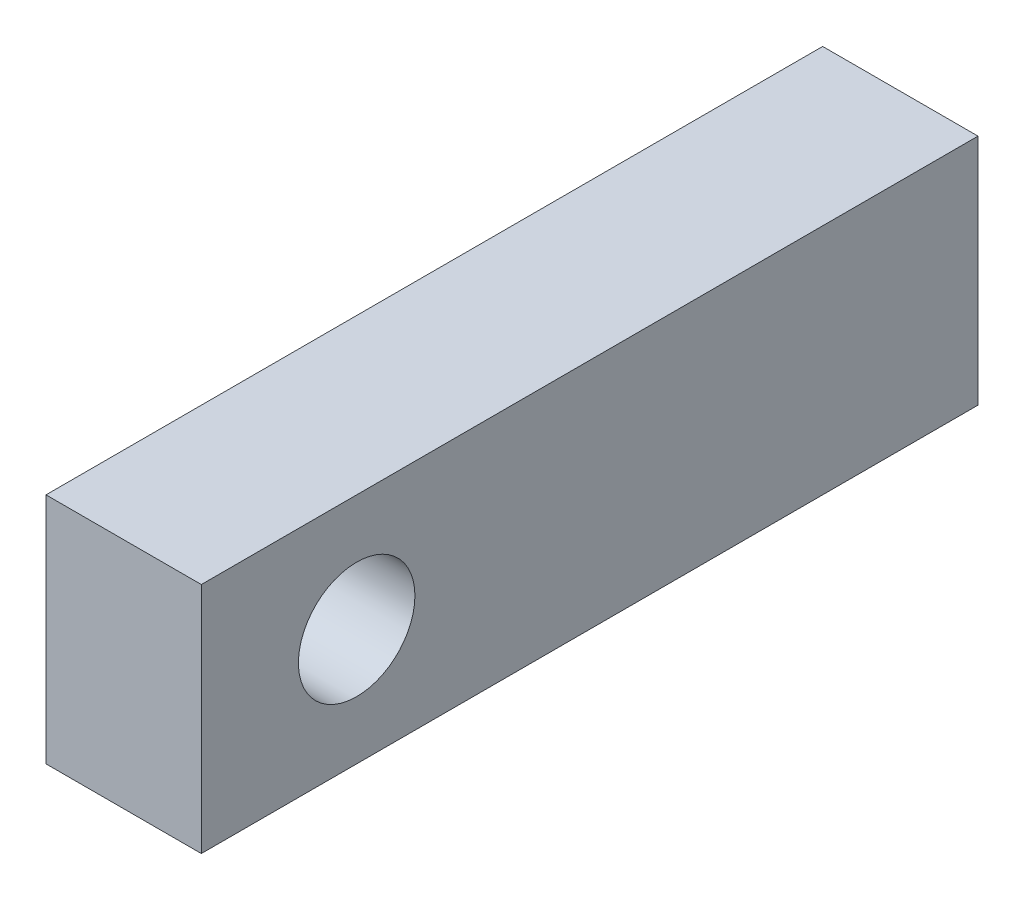
ISO-10303-21;
HEADER;
FILE_DESCRIPTION(('STEP AP214'),'2;1');
FILE_NAME('part.step','',(''),(''),'','','');
FILE_SCHEMA(('AUTOMOTIVE_DESIGN { 1 0 10303 214 1 1 1 1 }'));
ENDSEC;
DATA;
#1=APPLICATION_CONTEXT('core data for automotive mechanical design processes');
#2=APPLICATION_PROTOCOL_DEFINITION('international standard','automotive_design',2000,#1);
#3=PRODUCT_CONTEXT('',#1,'mechanical');
#4=PRODUCT('Part','Part','',(#3));
#5=PRODUCT_RELATED_PRODUCT_CATEGORY('part','',(#4));
#6=PRODUCT_DEFINITION_FORMATION('','',#4);
#7=PRODUCT_DEFINITION_CONTEXT('part definition',#1,'design');
#8=PRODUCT_DEFINITION('design','',#6,#7);
#9=PRODUCT_DEFINITION_SHAPE('','',#8);
#10=(LENGTH_UNIT() NAMED_UNIT(*) SI_UNIT(.MILLI.,.METRE.));
#11=(NAMED_UNIT(*) PLANE_ANGLE_UNIT() SI_UNIT($,.RADIAN.));
#12=(NAMED_UNIT(*) SI_UNIT($,.STERADIAN.) SOLID_ANGLE_UNIT());
#13=UNCERTAINTY_MEASURE_WITH_UNIT(LENGTH_MEASURE(1.E-05),#10,'distance_accuracy_value','');
#14=(GEOMETRIC_REPRESENTATION_CONTEXT(3) GLOBAL_UNCERTAINTY_ASSIGNED_CONTEXT((#13)) GLOBAL_UNIT_ASSIGNED_CONTEXT((#10,
#11,#12)) REPRESENTATION_CONTEXT('',''));
#15=CARTESIAN_POINT('',(0.,0.,0.));
#16=DIRECTION('',(0.,0.,1.));
#17=DIRECTION('',(1.,0.,0.));
#18=AXIS2_PLACEMENT_3D('',#15,#16,#17);
#19=CARTESIAN_POINT('',(0.,0.,127.));
#20=DIRECTION('',(1.,0.,0.));
#21=DIRECTION('',(0.,0.,-1.));
#22=AXIS2_PLACEMENT_3D('',#19,#20,#21);
#23=PLANE('',#22);
#24=CARTESIAN_POINT('',(0.,19.05,101.6));
#25=DIRECTION('',(1.,0.,0.));
#26=DIRECTION('',(0.,0.,-1.));
#27=AXIS2_PLACEMENT_3D('',#24,#25,#26);
#28=CIRCLE('',#27,9.52500000000001);
#29=CARTESIAN_POINT('',(0.,19.05,92.075));
#30=VERTEX_POINT('',#29);
#31=EDGE_CURVE('E102',#30,#30,#28,.T.);
#32=ORIENTED_EDGE('',*,*,#31,.T.);
#33=EDGE_LOOP('',(#32));
#34=FACE_BOUND('',#33,.T.);
#35=DIRECTION('',(0.,-1.,0.));
#36=VECTOR('',#35,1.);
#37=CARTESIAN_POINT('',(0.,0.,0.));
#38=LINE('',#37,#36);
#39=CARTESIAN_POINT('',(0.,38.1,0.));
#40=VERTEX_POINT('',#39);
#41=CARTESIAN_POINT('',(0.,0.,0.));
#42=VERTEX_POINT('',#41);
#43=EDGE_CURVE('E99',#40,#42,#38,.T.);
#44=ORIENTED_EDGE('',*,*,#43,.T.);
#45=DIRECTION('',(0.,0.,-1.));
#46=VECTOR('',#45,1.);
#47=CARTESIAN_POINT('',(0.,0.,127.));
#48=LINE('',#47,#46);
#49=CARTESIAN_POINT('',(0.,0.,127.));
#50=VERTEX_POINT('',#49);
#51=EDGE_CURVE('E11',#50,#42,#48,.T.);
#52=ORIENTED_EDGE('',*,*,#51,.F.);
#53=DIRECTION('',(0.,-1.,0.));
#54=VECTOR('',#53,1.);
#55=CARTESIAN_POINT('',(0.,0.,127.));
#56=LINE('',#55,#54);
#57=CARTESIAN_POINT('',(0.,38.1,127.));
#58=VERTEX_POINT('',#57);
#59=EDGE_CURVE('E87',#58,#50,#56,.T.);
#60=ORIENTED_EDGE('',*,*,#59,.F.);
#61=DIRECTION('',(0.,0.,-1.));
#62=VECTOR('',#61,1.);
#63=CARTESIAN_POINT('',(0.,38.1,127.));
#64=LINE('',#63,#62);
#65=EDGE_CURVE('E95',#58,#40,#64,.T.);
#66=ORIENTED_EDGE('',*,*,#65,.T.);
#67=EDGE_LOOP('',(#44,#52,#60,#66));
#68=FACE_BOUND('',#67,.T.);
#69=ADVANCED_FACE('F36',(#34,#68),#23,.F.);
#70=CARTESIAN_POINT('',(0.,0.,127.));
#71=DIRECTION('',(0.,1.,0.));
#72=DIRECTION('',(0.,0.,1.));
#73=AXIS2_PLACEMENT_3D('',#70,#71,#72);
#74=PLANE('',#73);
#75=DIRECTION('',(1.,0.,0.));
#76=VECTOR('',#75,1.);
#77=CARTESIAN_POINT('',(0.,0.,0.));
#78=LINE('',#77,#76);
#79=CARTESIAN_POINT('',(25.4,0.,0.));
#80=VERTEX_POINT('',#79);
#81=EDGE_CURVE('E91',#42,#80,#78,.T.);
#82=ORIENTED_EDGE('',*,*,#81,.T.);
#83=DIRECTION('',(0.,0.,-1.));
#84=VECTOR('',#83,1.);
#85=CARTESIAN_POINT('',(25.4,0.,127.));
#86=LINE('',#85,#84);
#87=CARTESIAN_POINT('',(25.4,0.,127.));
#88=VERTEX_POINT('',#87);
#89=EDGE_CURVE('E44',#88,#80,#86,.T.);
#90=ORIENTED_EDGE('',*,*,#89,.F.);
#91=DIRECTION('',(1.,0.,0.));
#92=VECTOR('',#91,1.);
#93=CARTESIAN_POINT('',(0.,0.,127.));
#94=LINE('',#93,#92);
#95=EDGE_CURVE('E82',#50,#88,#94,.T.);
#96=ORIENTED_EDGE('',*,*,#95,.F.);
#97=ORIENTED_EDGE('',*,*,#51,.T.);
#98=EDGE_LOOP('',(#82,#90,#96,#97));
#99=FACE_BOUND('',#98,.T.);
#100=ADVANCED_FACE('F90',(#99),#74,.F.);
#101=CARTESIAN_POINT('',(25.4,0.,127.));
#102=DIRECTION('',(-1.,0.,0.));
#103=DIRECTION('',(0.,0.,1.));
#104=AXIS2_PLACEMENT_3D('',#101,#102,#103);
#105=PLANE('',#104);
#106=CARTESIAN_POINT('',(25.4,19.05,101.6));
#107=DIRECTION('',(1.,0.,0.));
#108=DIRECTION('',(0.,0.,-1.));
#109=AXIS2_PLACEMENT_3D('',#106,#107,#108);
#110=CIRCLE('',#109,9.52500000000001);
#111=CARTESIAN_POINT('',(25.4,19.05,92.075));
#112=VERTEX_POINT('',#111);
#113=EDGE_CURVE('E113',#112,#112,#110,.T.);
#114=ORIENTED_EDGE('',*,*,#113,.F.);
#115=EDGE_LOOP('',(#114));
#116=FACE_BOUND('',#115,.T.);
#117=DIRECTION('',(0.,1.,0.));
#118=VECTOR('',#117,1.);
#119=CARTESIAN_POINT('',(25.4,0.,0.));
#120=LINE('',#119,#118);
#121=CARTESIAN_POINT('',(25.4,38.1,0.));
#122=VERTEX_POINT('',#121);
#123=EDGE_CURVE('E69',#80,#122,#120,.T.);
#124=ORIENTED_EDGE('',*,*,#123,.T.);
#125=DIRECTION('',(0.,0.,-1.));
#126=VECTOR('',#125,1.);
#127=CARTESIAN_POINT('',(25.4,38.1,127.));
#128=LINE('',#127,#126);
#129=CARTESIAN_POINT('',(25.4,38.1,127.));
#130=VERTEX_POINT('',#129);
#131=EDGE_CURVE('E92',#130,#122,#128,.T.);
#132=ORIENTED_EDGE('',*,*,#131,.F.);
#133=DIRECTION('',(0.,1.,0.));
#134=VECTOR('',#133,1.);
#135=CARTESIAN_POINT('',(25.4,0.,127.));
#136=LINE('',#135,#134);
#137=EDGE_CURVE('E85',#88,#130,#136,.T.);
#138=ORIENTED_EDGE('',*,*,#137,.F.);
#139=ORIENTED_EDGE('',*,*,#89,.T.);
#140=EDGE_LOOP('',(#124,#132,#138,#139));
#141=FACE_BOUND('',#140,.T.);
#142=ADVANCED_FACE('F93',(#116,#141),#105,.F.);
#143=CARTESIAN_POINT('',(0.,38.1,127.));
#144=DIRECTION('',(0.,-1.,0.));
#145=DIRECTION('',(0.,0.,-1.));
#146=AXIS2_PLACEMENT_3D('',#143,#144,#145);
#147=PLANE('',#146);
#148=DIRECTION('',(-1.,0.,0.));
#149=VECTOR('',#148,1.);
#150=CARTESIAN_POINT('',(0.,38.1,0.));
#151=LINE('',#150,#149);
#152=EDGE_CURVE('E75',#122,#40,#151,.T.);
#153=ORIENTED_EDGE('',*,*,#152,.T.);
#154=ORIENTED_EDGE('',*,*,#65,.F.);
#155=DIRECTION('',(-1.,0.,0.));
#156=VECTOR('',#155,1.);
#157=CARTESIAN_POINT('',(0.,38.1,127.));
#158=LINE('',#157,#156);
#159=EDGE_CURVE('E52',#130,#58,#158,.T.);
#160=ORIENTED_EDGE('',*,*,#159,.F.);
#161=ORIENTED_EDGE('',*,*,#131,.T.);
#162=EDGE_LOOP('',(#153,#154,#160,#161));
#163=FACE_BOUND('',#162,.T.);
#164=ADVANCED_FACE('F107',(#163),#147,.F.);
#165=CARTESIAN_POINT('',(0.,0.,127.));
#166=DIRECTION('',(0.,0.,-1.));
#167=DIRECTION('',(-1.,0.,0.));
#168=AXIS2_PLACEMENT_3D('',#165,#166,#167);
#169=PLANE('',#168);
#170=ORIENTED_EDGE('',*,*,#59,.T.);
#171=ORIENTED_EDGE('',*,*,#95,.T.);
#172=ORIENTED_EDGE('',*,*,#137,.T.);
#173=ORIENTED_EDGE('',*,*,#159,.T.);
#174=EDGE_LOOP('',(#170,#171,#172,#173));
#175=FACE_BOUND('',#174,.T.);
#176=ADVANCED_FACE('F83',(#175),#169,.F.);
#177=CARTESIAN_POINT('',(0.,0.,0.));
#178=DIRECTION('',(0.,0.,-1.));
#179=DIRECTION('',(-1.,0.,0.));
#180=AXIS2_PLACEMENT_3D('',#177,#178,#179);
#181=PLANE('',#180);
#182=ORIENTED_EDGE('',*,*,#43,.F.);
#183=ORIENTED_EDGE('',*,*,#152,.F.);
#184=ORIENTED_EDGE('',*,*,#123,.F.);
#185=ORIENTED_EDGE('',*,*,#81,.F.);
#186=EDGE_LOOP('',(#182,#183,#184,#185));
#187=FACE_BOUND('',#186,.T.);
#188=ADVANCED_FACE('F110',(#187),#181,.T.);
#189=CARTESIAN_POINT('',(0.,19.05,101.6));
#190=DIRECTION('',(1.,0.,0.));
#191=DIRECTION('',(0.,0.,-1.));
#192=AXIS2_PLACEMENT_3D('',#189,#190,#191);
#193=CYLINDRICAL_SURFACE('',#192,9.52500000000001);
#194=ORIENTED_EDGE('',*,*,#31,.F.);
#195=EDGE_LOOP('',(#194));
#196=FACE_BOUND('',#195,.T.);
#197=ORIENTED_EDGE('',*,*,#113,.T.);
#198=EDGE_LOOP('',(#197));
#199=FACE_BOUND('',#198,.T.);
#200=ADVANCED_FACE('F120',(#196,#199),#193,.F.);
#201=CLOSED_SHELL('',(#69,#100,#142,#164,#176,#188,#200));
#202=MANIFOLD_SOLID_BREP('B2',#201);
#203=ADVANCED_BREP_SHAPE_REPRESENTATION('',(#18,#202),#14);
#204=SHAPE_DEFINITION_REPRESENTATION(#9,#203);
ENDSEC;
END-ISO-10303-21;
